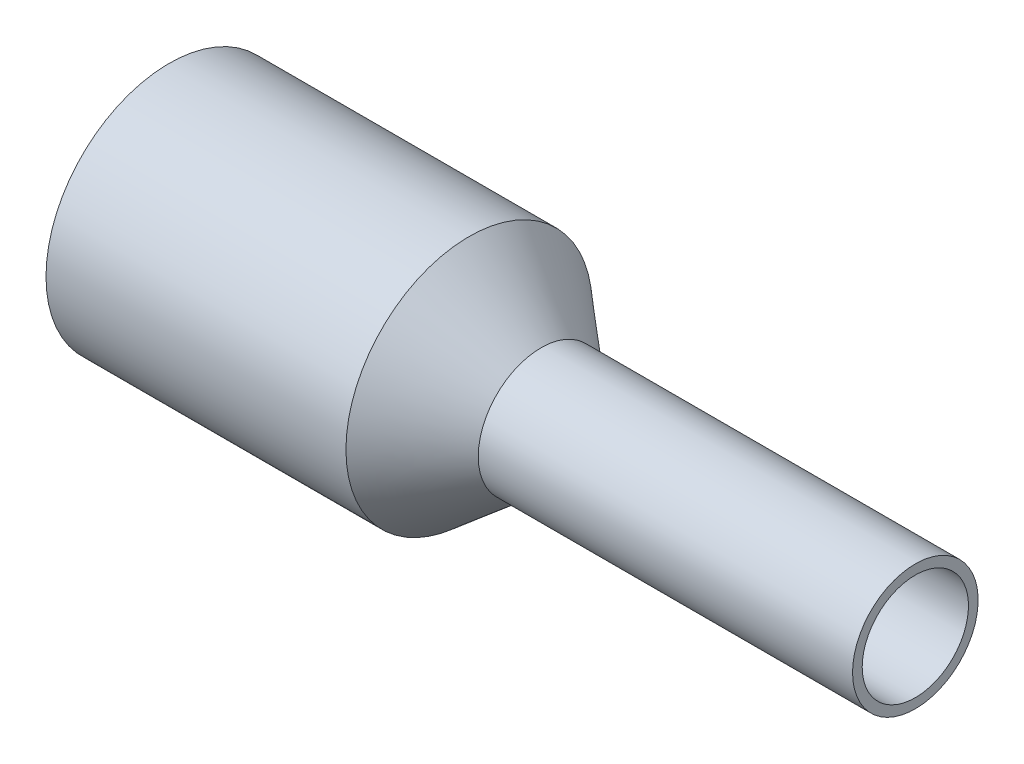
ISO-10303-21;
HEADER;
FILE_DESCRIPTION(('STEP AP214'),'2;1');
FILE_NAME('part.step','',(''),(''),'','','');
FILE_SCHEMA(('AUTOMOTIVE_DESIGN { 1 0 10303 214 1 1 1 1 }'));
ENDSEC;
DATA;
#1=APPLICATION_CONTEXT('core data for automotive mechanical design processes');
#2=APPLICATION_PROTOCOL_DEFINITION('international standard','automotive_design',2000,#1);
#3=PRODUCT_CONTEXT('',#1,'mechanical');
#4=PRODUCT('Part','Part','',(#3));
#5=PRODUCT_RELATED_PRODUCT_CATEGORY('part','',(#4));
#6=PRODUCT_DEFINITION_FORMATION('','',#4);
#7=PRODUCT_DEFINITION_CONTEXT('part definition',#1,'design');
#8=PRODUCT_DEFINITION('design','',#6,#7);
#9=PRODUCT_DEFINITION_SHAPE('','',#8);
#10=(LENGTH_UNIT() NAMED_UNIT(*) SI_UNIT(.MILLI.,.METRE.));
#11=(NAMED_UNIT(*) PLANE_ANGLE_UNIT() SI_UNIT($,.RADIAN.));
#12=(NAMED_UNIT(*) SI_UNIT($,.STERADIAN.) SOLID_ANGLE_UNIT());
#13=UNCERTAINTY_MEASURE_WITH_UNIT(LENGTH_MEASURE(1.E-05),#10,'distance_accuracy_value','');
#14=(GEOMETRIC_REPRESENTATION_CONTEXT(3) GLOBAL_UNCERTAINTY_ASSIGNED_CONTEXT((#13)) GLOBAL_UNIT_ASSIGNED_CONTEXT((#10,
#11,#12)) REPRESENTATION_CONTEXT('',''));
#15=CARTESIAN_POINT('',(0.,0.,0.));
#16=DIRECTION('',(0.,0.,1.));
#17=DIRECTION('',(1.,0.,0.));
#18=AXIS2_PLACEMENT_3D('',#15,#16,#17);
#19=CARTESIAN_POINT('',(7.725,1.1,0.));
#20=DIRECTION('',(-1.,0.,0.));
#21=DIRECTION('',(0.,0.,1.));
#22=AXIS2_PLACEMENT_3D('',#19,#20,#21);
#23=PLANE('',#22);
#24=CARTESIAN_POINT('',(7.725,0.,0.));
#25=DIRECTION('',(-1.,0.,0.));
#26=DIRECTION('',(0.,0.,1.));
#27=AXIS2_PLACEMENT_3D('',#24,#25,#26);
#28=CIRCLE('',#27,1.3);
#29=CARTESIAN_POINT('',(7.725,0.,1.3));
#30=VERTEX_POINT('',#29);
#31=EDGE_CURVE('E10',#30,#30,#28,.T.);
#32=ORIENTED_EDGE('',*,*,#31,.F.);
#33=EDGE_LOOP('',(#32));
#34=FACE_BOUND('',#33,.T.);
#35=CARTESIAN_POINT('',(7.725,0.,0.));
#36=DIRECTION('',(-1.,0.,0.));
#37=DIRECTION('',(0.,0.,1.));
#38=AXIS2_PLACEMENT_3D('',#35,#36,#37);
#39=CIRCLE('',#38,1.1);
#40=CARTESIAN_POINT('',(7.725,0.,1.1));
#41=VERTEX_POINT('',#40);
#42=EDGE_CURVE('E60',#41,#41,#39,.T.);
#43=ORIENTED_EDGE('',*,*,#42,.T.);
#44=EDGE_LOOP('',(#43));
#45=FACE_BOUND('',#44,.T.);
#46=ADVANCED_FACE('F32',(#34,#45),#23,.F.);
#47=CARTESIAN_POINT('',(-7.725,0.,0.));
#48=DIRECTION('',(-1.,0.,0.));
#49=DIRECTION('',(0.,0.,1.));
#50=AXIS2_PLACEMENT_3D('',#47,#48,#49);
#51=CYLINDRICAL_SURFACE('',#50,1.3);
#52=CARTESIAN_POINT('',(-0.0250000000000007,0.,0.));
#53=DIRECTION('',(-1.,0.,0.));
#54=DIRECTION('',(0.,0.,1.));
#55=AXIS2_PLACEMENT_3D('',#52,#53,#54);
#56=CIRCLE('',#55,1.3);
#57=CARTESIAN_POINT('',(-0.0250000000000007,0.,1.3));
#58=VERTEX_POINT('',#57);
#59=EDGE_CURVE('E38',#58,#58,#56,.T.);
#60=ORIENTED_EDGE('',*,*,#59,.F.);
#61=EDGE_LOOP('',(#60));
#62=FACE_BOUND('',#61,.T.);
#63=ORIENTED_EDGE('',*,*,#31,.T.);
#64=EDGE_LOOP('',(#63));
#65=FACE_BOUND('',#64,.T.);
#66=ADVANCED_FACE('F97',(#62,#65),#51,.T.);
#67=CARTESIAN_POINT('',(-0.0250000000000007,0.,0.));
#68=DIRECTION('',(-1.,0.,0.));
#69=DIRECTION('',(0.,0.,1.));
#70=AXIS2_PLACEMENT_3D('',#67,#68,#69);
#71=CONICAL_SURFACE('',#70,1.3,0.698131700797726);
#72=CARTESIAN_POINT('',(-1.51469199074278,0.,0.));
#73=DIRECTION('',(-1.,0.,0.));
#74=DIRECTION('',(0.,0.,1.));
#75=AXIS2_PLACEMENT_3D('',#72,#73,#74);
#76=CIRCLE('',#75,2.55);
#77=CARTESIAN_POINT('',(-1.51469199074278,0.,2.55));
#78=VERTEX_POINT('',#77);
#79=EDGE_CURVE('E42',#78,#78,#76,.T.);
#80=ORIENTED_EDGE('',*,*,#79,.F.);
#81=EDGE_LOOP('',(#80));
#82=FACE_BOUND('',#81,.T.);
#83=ORIENTED_EDGE('',*,*,#59,.T.);
#84=EDGE_LOOP('',(#83));
#85=FACE_BOUND('',#84,.T.);
#86=ADVANCED_FACE('F92',(#82,#85),#71,.T.);
#87=CARTESIAN_POINT('',(-7.725,0.,0.));
#88=DIRECTION('',(-1.,0.,0.));
#89=DIRECTION('',(0.,0.,1.));
#90=AXIS2_PLACEMENT_3D('',#87,#88,#89);
#91=CYLINDRICAL_SURFACE('',#90,2.55);
#92=CARTESIAN_POINT('',(-7.725,0.,0.));
#93=DIRECTION('',(-1.,0.,0.));
#94=DIRECTION('',(0.,0.,1.));
#95=AXIS2_PLACEMENT_3D('',#92,#93,#94);
#96=CIRCLE('',#95,2.55);
#97=CARTESIAN_POINT('',(-7.725,0.,2.55));
#98=VERTEX_POINT('',#97);
#99=EDGE_CURVE('E46',#98,#98,#96,.T.);
#100=ORIENTED_EDGE('',*,*,#99,.F.);
#101=EDGE_LOOP('',(#100));
#102=FACE_BOUND('',#101,.T.);
#103=ORIENTED_EDGE('',*,*,#79,.T.);
#104=EDGE_LOOP('',(#103));
#105=FACE_BOUND('',#104,.T.);
#106=ADVANCED_FACE('F86',(#102,#105),#91,.T.);
#107=CARTESIAN_POINT('',(-7.725,2.05,0.));
#108=DIRECTION('',(1.,0.,0.));
#109=DIRECTION('',(0.,0.,-1.));
#110=AXIS2_PLACEMENT_3D('',#107,#108,#109);
#111=PLANE('',#110);
#112=CARTESIAN_POINT('',(-7.725,0.,0.));
#113=DIRECTION('',(-1.,0.,0.));
#114=DIRECTION('',(0.,0.,1.));
#115=AXIS2_PLACEMENT_3D('',#112,#113,#114);
#116=CIRCLE('',#115,2.05);
#117=CARTESIAN_POINT('',(-7.725,0.,2.05));
#118=VERTEX_POINT('',#117);
#119=EDGE_CURVE('E51',#118,#118,#116,.T.);
#120=ORIENTED_EDGE('',*,*,#119,.F.);
#121=EDGE_LOOP('',(#120));
#122=FACE_BOUND('',#121,.T.);
#123=ORIENTED_EDGE('',*,*,#99,.T.);
#124=EDGE_LOOP('',(#123));
#125=FACE_BOUND('',#124,.T.);
#126=ADVANCED_FACE('F80',(#122,#125),#111,.F.);
#127=CARTESIAN_POINT('',(-7.725,0.,0.));
#128=DIRECTION('',(-1.,0.,0.));
#129=DIRECTION('',(0.,0.,1.));
#130=AXIS2_PLACEMENT_3D('',#127,#128,#129);
#131=CYLINDRICAL_SURFACE('',#130,2.05);
#132=CARTESIAN_POINT('',(-1.51469199074278,0.,0.));
#133=DIRECTION('',(-1.,0.,0.));
#134=DIRECTION('',(0.,0.,1.));
#135=AXIS2_PLACEMENT_3D('',#132,#133,#134);
#136=CIRCLE('',#135,2.05);
#137=CARTESIAN_POINT('',(-1.51469199074278,0.,2.05));
#138=VERTEX_POINT('',#137);
#139=EDGE_CURVE('E54',#138,#138,#136,.T.);
#140=ORIENTED_EDGE('',*,*,#139,.F.);
#141=EDGE_LOOP('',(#140));
#142=FACE_BOUND('',#141,.T.);
#143=ORIENTED_EDGE('',*,*,#119,.T.);
#144=EDGE_LOOP('',(#143));
#145=FACE_BOUND('',#144,.T.);
#146=ADVANCED_FACE('F74',(#142,#145),#131,.F.);
#147=CARTESIAN_POINT('',(-1.51469199074278,0.,0.));
#148=DIRECTION('',(-1.,0.,0.));
#149=DIRECTION('',(0.,0.,1.));
#150=AXIS2_PLACEMENT_3D('',#147,#148,#149);
#151=CONICAL_SURFACE('',#150,2.05,0.567690993416027);
#152=CARTESIAN_POINT('',(-0.0250000000000007,0.,0.));
#153=DIRECTION('',(-1.,0.,0.));
#154=DIRECTION('',(0.,0.,1.));
#155=AXIS2_PLACEMENT_3D('',#152,#153,#154);
#156=CIRCLE('',#155,1.1);
#157=CARTESIAN_POINT('',(-0.0250000000000007,0.,1.1));
#158=VERTEX_POINT('',#157);
#159=EDGE_CURVE('E57',#158,#158,#156,.T.);
#160=ORIENTED_EDGE('',*,*,#159,.F.);
#161=EDGE_LOOP('',(#160));
#162=FACE_BOUND('',#161,.T.);
#163=ORIENTED_EDGE('',*,*,#139,.T.);
#164=EDGE_LOOP('',(#163));
#165=FACE_BOUND('',#164,.T.);
#166=ADVANCED_FACE('F68',(#162,#165),#151,.F.);
#167=CARTESIAN_POINT('',(-7.725,0.,0.));
#168=DIRECTION('',(-1.,0.,0.));
#169=DIRECTION('',(0.,0.,1.));
#170=AXIS2_PLACEMENT_3D('',#167,#168,#169);
#171=CYLINDRICAL_SURFACE('',#170,1.1);
#172=ORIENTED_EDGE('',*,*,#42,.F.);
#173=EDGE_LOOP('',(#172));
#174=FACE_BOUND('',#173,.T.);
#175=ORIENTED_EDGE('',*,*,#159,.T.);
#176=EDGE_LOOP('',(#175));
#177=FACE_BOUND('',#176,.T.);
#178=ADVANCED_FACE('F65',(#174,#177),#171,.F.);
#179=CLOSED_SHELL('',(#46,#66,#86,#106,#126,#146,#166,#178));
#180=MANIFOLD_SOLID_BREP('B2',#179);
#181=ADVANCED_BREP_SHAPE_REPRESENTATION('',(#18,#180),#14);
#182=SHAPE_DEFINITION_REPRESENTATION(#9,#181);
ENDSEC;
END-ISO-10303-21;
